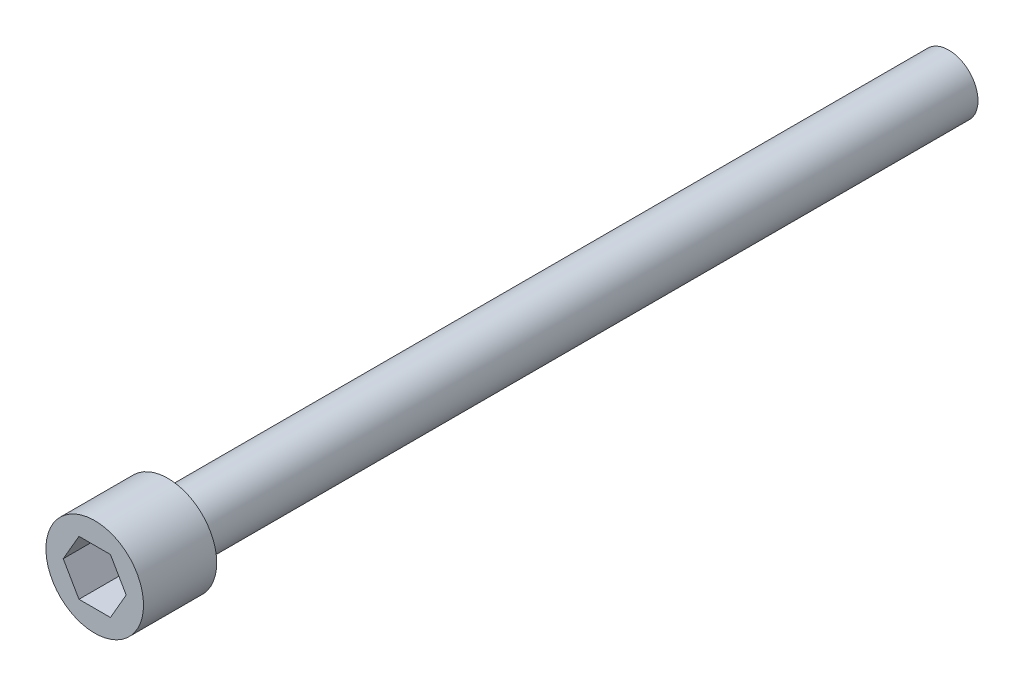
ISO-10303-21;
HEADER;
FILE_DESCRIPTION(('STEP AP214'),'2;1');
FILE_NAME('part.step','',(''),(''),'','','');
FILE_SCHEMA(('AUTOMOTIVE_DESIGN { 1 0 10303 214 1 1 1 1 }'));
ENDSEC;
DATA;
#1=APPLICATION_CONTEXT('core data for automotive mechanical design processes');
#2=APPLICATION_PROTOCOL_DEFINITION('international standard','automotive_design',2000,#1);
#3=PRODUCT_CONTEXT('',#1,'mechanical');
#4=PRODUCT('Part','Part','',(#3));
#5=PRODUCT_RELATED_PRODUCT_CATEGORY('part','',(#4));
#6=PRODUCT_DEFINITION_FORMATION('','',#4);
#7=PRODUCT_DEFINITION_CONTEXT('part definition',#1,'design');
#8=PRODUCT_DEFINITION('design','',#6,#7);
#9=PRODUCT_DEFINITION_SHAPE('','',#8);
#10=(LENGTH_UNIT() NAMED_UNIT(*) SI_UNIT(.MILLI.,.METRE.));
#11=(NAMED_UNIT(*) PLANE_ANGLE_UNIT() SI_UNIT($,.RADIAN.));
#12=(NAMED_UNIT(*) SI_UNIT($,.STERADIAN.) SOLID_ANGLE_UNIT());
#13=UNCERTAINTY_MEASURE_WITH_UNIT(LENGTH_MEASURE(1.E-05),#10,'distance_accuracy_value','');
#14=(GEOMETRIC_REPRESENTATION_CONTEXT(3) GLOBAL_UNCERTAINTY_ASSIGNED_CONTEXT((#13)) GLOBAL_UNIT_ASSIGNED_CONTEXT((#10,
#11,#12)) REPRESENTATION_CONTEXT('',''));
#15=CARTESIAN_POINT('',(0.,0.,0.));
#16=DIRECTION('',(0.,0.,1.));
#17=DIRECTION('',(1.,0.,0.));
#18=AXIS2_PLACEMENT_3D('',#15,#16,#17);
#19=CARTESIAN_POINT('',(-15.,15.,-32.));
#20=DIRECTION('',(0.,0.,1.));
#21=DIRECTION('',(1.,0.,0.));
#22=AXIS2_PLACEMENT_3D('',#19,#20,#21);
#23=CYLINDRICAL_SURFACE('',#22,1.2);
#24=CARTESIAN_POINT('',(-15.,15.,-32.));
#25=DIRECTION('',(0.,0.,1.));
#26=DIRECTION('',(1.,0.,0.));
#27=AXIS2_PLACEMENT_3D('',#24,#25,#26);
#28=CIRCLE('',#27,1.2);
#29=CARTESIAN_POINT('',(-13.8,15.,-32.));
#30=VERTEX_POINT('',#29);
#31=EDGE_CURVE('E11',#30,#30,#28,.T.);
#32=ORIENTED_EDGE('',*,*,#31,.T.);
#33=EDGE_LOOP('',(#32));
#34=FACE_BOUND('',#33,.T.);
#35=CARTESIAN_POINT('',(-15.,15.,0.));
#36=DIRECTION('',(0.,0.,1.));
#37=DIRECTION('',(1.,0.,0.));
#38=AXIS2_PLACEMENT_3D('',#35,#36,#37);
#39=CIRCLE('',#38,1.2);
#40=CARTESIAN_POINT('',(-13.8,15.,0.));
#41=VERTEX_POINT('',#40);
#42=EDGE_CURVE('E36',#41,#41,#39,.T.);
#43=ORIENTED_EDGE('',*,*,#42,.F.);
#44=EDGE_LOOP('',(#43));
#45=FACE_BOUND('',#44,.T.);
#46=ADVANCED_FACE('F33',(#34,#45),#23,.T.);
#47=CARTESIAN_POINT('',(-15.,15.,-32.));
#48=DIRECTION('',(0.,0.,1.));
#49=DIRECTION('',(1.,0.,0.));
#50=AXIS2_PLACEMENT_3D('',#47,#48,#49);
#51=PLANE('',#50);
#52=ORIENTED_EDGE('',*,*,#31,.F.);
#53=EDGE_LOOP('',(#52));
#54=FACE_BOUND('',#53,.T.);
#55=ADVANCED_FACE('F165',(#54),#51,.F.);
#56=CARTESIAN_POINT('',(-15.,15.,3.));
#57=DIRECTION('',(0.,0.,-1.));
#58=DIRECTION('',(-1.,0.,0.));
#59=AXIS2_PLACEMENT_3D('',#56,#57,#58);
#60=CYLINDRICAL_SURFACE('',#59,2.);
#61=CARTESIAN_POINT('',(-15.,15.,3.));
#62=DIRECTION('',(0.,0.,1.));
#63=DIRECTION('',(1.,0.,0.));
#64=AXIS2_PLACEMENT_3D('',#61,#62,#63);
#65=CIRCLE('',#64,2.);
#66=CARTESIAN_POINT('',(-13.,15.,3.));
#67=VERTEX_POINT('',#66);
#68=EDGE_CURVE('E140',#67,#67,#65,.T.);
#69=ORIENTED_EDGE('',*,*,#68,.F.);
#70=EDGE_LOOP('',(#69));
#71=FACE_BOUND('',#70,.T.);
#72=CARTESIAN_POINT('',(-15.,15.,0.));
#73=DIRECTION('',(0.,0.,1.));
#74=DIRECTION('',(1.,0.,0.));
#75=AXIS2_PLACEMENT_3D('',#72,#73,#74);
#76=CIRCLE('',#75,2.);
#77=CARTESIAN_POINT('',(-13.,15.,0.));
#78=VERTEX_POINT('',#77);
#79=EDGE_CURVE('E134',#78,#78,#76,.T.);
#80=ORIENTED_EDGE('',*,*,#79,.T.);
#81=EDGE_LOOP('',(#80));
#82=FACE_BOUND('',#81,.T.);
#83=ADVANCED_FACE('F146',(#71,#82),#60,.T.);
#84=CARTESIAN_POINT('',(-15.,15.,3.));
#85=DIRECTION('',(0.,0.,1.));
#86=DIRECTION('',(1.,0.,0.));
#87=AXIS2_PLACEMENT_3D('',#84,#85,#86);
#88=PLANE('',#87);
#89=DIRECTION('',(0.499999999999995,0.866025403784442,0.));
#90=VECTOR('',#89,1.);
#91=CARTESIAN_POINT('',(-14.3549738433214,13.8827819244218,3.));
#92=LINE('',#91,#90);
#93=CARTESIAN_POINT('',(-14.3549738433214,13.8827819244218,3.));
#94=VERTEX_POINT('',#93);
#95=CARTESIAN_POINT('',(-13.7099476866428,15.,3.));
#96=VERTEX_POINT('',#95);
#97=EDGE_CURVE('E47',#94,#96,#92,.T.);
#98=ORIENTED_EDGE('',*,*,#97,.F.);
#99=DIRECTION('',(1.,0.,0.));
#100=VECTOR('',#99,1.);
#101=CARTESIAN_POINT('',(-15.6450261566786,13.8827819244218,3.));
#102=LINE('',#101,#100);
#103=CARTESIAN_POINT('',(-15.6450261566786,13.8827819244218,3.));
#104=VERTEX_POINT('',#103);
#105=EDGE_CURVE('E130',#104,#94,#102,.T.);
#106=ORIENTED_EDGE('',*,*,#105,.F.);
#107=DIRECTION('',(0.500000000000006,-0.866025403784435,0.));
#108=VECTOR('',#107,1.);
#109=CARTESIAN_POINT('',(-16.2900523133572,15.,3.));
#110=LINE('',#109,#108);
#111=CARTESIAN_POINT('',(-16.2900523133572,15.,3.));
#112=VERTEX_POINT('',#111);
#113=EDGE_CURVE('E128',#112,#104,#110,.T.);
#114=ORIENTED_EDGE('',*,*,#113,.F.);
#115=DIRECTION('',(-0.499999999999995,-0.866025403784442,0.));
#116=VECTOR('',#115,1.);
#117=CARTESIAN_POINT('',(-15.6450261566786,16.1172180755782,3.));
#118=LINE('',#117,#116);
#119=CARTESIAN_POINT('',(-15.6450261566786,16.1172180755782,3.));
#120=VERTEX_POINT('',#119);
#121=EDGE_CURVE('E95',#120,#112,#118,.T.);
#122=ORIENTED_EDGE('',*,*,#121,.F.);
#123=DIRECTION('',(-1.,0.,0.));
#124=VECTOR('',#123,1.);
#125=CARTESIAN_POINT('',(-14.3549738433214,16.1172180755782,3.));
#126=LINE('',#125,#124);
#127=CARTESIAN_POINT('',(-14.3549738433214,16.1172180755782,3.));
#128=VERTEX_POINT('',#127);
#129=EDGE_CURVE('E124',#128,#120,#126,.T.);
#130=ORIENTED_EDGE('',*,*,#129,.F.);
#131=DIRECTION('',(-0.500000000000002,0.866025403784438,0.));
#132=VECTOR('',#131,1.);
#133=CARTESIAN_POINT('',(-13.7099476866428,15.,3.));
#134=LINE('',#133,#132);
#135=EDGE_CURVE('E121',#96,#128,#134,.T.);
#136=ORIENTED_EDGE('',*,*,#135,.F.);
#137=EDGE_LOOP('',(#98,#106,#114,#122,#130,#136));
#138=FACE_BOUND('',#137,.T.);
#139=ORIENTED_EDGE('',*,*,#68,.T.);
#140=EDGE_LOOP('',(#139));
#141=FACE_BOUND('',#140,.T.);
#142=ADVANCED_FACE('F151',(#138,#141),#88,.T.);
#143=CARTESIAN_POINT('',(-15.,15.,0.));
#144=DIRECTION('',(0.,0.,1.));
#145=DIRECTION('',(1.,0.,0.));
#146=AXIS2_PLACEMENT_3D('',#143,#144,#145);
#147=PLANE('',#146);
#148=ORIENTED_EDGE('',*,*,#42,.T.);
#149=EDGE_LOOP('',(#148));
#150=FACE_BOUND('',#149,.T.);
#151=ORIENTED_EDGE('',*,*,#79,.F.);
#152=EDGE_LOOP('',(#151));
#153=FACE_BOUND('',#152,.T.);
#154=ADVANCED_FACE('F148',(#150,#153),#147,.F.);
#155=CARTESIAN_POINT('',(-14.3549738433214,13.8827819244218,1.));
#156=DIRECTION('',(0.866025403784442,-0.499999999999995,0.));
#157=DIRECTION('',(0.499999999999995,0.866025403784442,0.));
#158=AXIS2_PLACEMENT_3D('',#155,#156,#157);
#159=PLANE('',#158);
#160=ORIENTED_EDGE('',*,*,#97,.T.);
#161=DIRECTION('',(0.,0.,1.));
#162=VECTOR('',#161,1.);
#163=CARTESIAN_POINT('',(-13.7099476866428,15.,1.));
#164=LINE('',#163,#162);
#165=CARTESIAN_POINT('',(-13.7099476866428,15.,1.));
#166=VERTEX_POINT('',#165);
#167=EDGE_CURVE('E77',#166,#96,#164,.T.);
#168=ORIENTED_EDGE('',*,*,#167,.F.);
#169=DIRECTION('',(0.499999999999995,0.866025403784442,0.));
#170=VECTOR('',#169,1.);
#171=CARTESIAN_POINT('',(-14.3549738433214,13.8827819244218,1.));
#172=LINE('',#171,#170);
#173=CARTESIAN_POINT('',(-14.3549738433214,13.8827819244218,1.));
#174=VERTEX_POINT('',#173);
#175=EDGE_CURVE('E132',#174,#166,#172,.T.);
#176=ORIENTED_EDGE('',*,*,#175,.F.);
#177=DIRECTION('',(0.,0.,1.));
#178=VECTOR('',#177,1.);
#179=CARTESIAN_POINT('',(-14.3549738433214,13.8827819244218,1.));
#180=LINE('',#179,#178);
#181=EDGE_CURVE('E55',#174,#94,#180,.T.);
#182=ORIENTED_EDGE('',*,*,#181,.T.);
#183=EDGE_LOOP('',(#160,#168,#176,#182));
#184=FACE_BOUND('',#183,.T.);
#185=ADVANCED_FACE('F150',(#184),#159,.F.);
#186=CARTESIAN_POINT('',(-15.6450261566786,13.8827819244218,1.));
#187=DIRECTION('',(0.,-1.,0.));
#188=DIRECTION('',(1.,0.,0.));
#189=AXIS2_PLACEMENT_3D('',#186,#187,#188);
#190=PLANE('',#189);
#191=ORIENTED_EDGE('',*,*,#105,.T.);
#192=ORIENTED_EDGE('',*,*,#181,.F.);
#193=DIRECTION('',(1.,0.,0.));
#194=VECTOR('',#193,1.);
#195=CARTESIAN_POINT('',(-15.6450261566786,13.8827819244218,1.));
#196=LINE('',#195,#194);
#197=CARTESIAN_POINT('',(-15.6450261566786,13.8827819244218,1.));
#198=VERTEX_POINT('',#197);
#199=EDGE_CURVE('E107',#198,#174,#196,.T.);
#200=ORIENTED_EDGE('',*,*,#199,.F.);
#201=DIRECTION('',(0.,0.,1.));
#202=VECTOR('',#201,1.);
#203=CARTESIAN_POINT('',(-15.6450261566786,13.8827819244218,1.));
#204=LINE('',#203,#202);
#205=EDGE_CURVE('E99',#198,#104,#204,.T.);
#206=ORIENTED_EDGE('',*,*,#205,.T.);
#207=EDGE_LOOP('',(#191,#192,#200,#206));
#208=FACE_BOUND('',#207,.T.);
#209=ADVANCED_FACE('F158',(#208),#190,.F.);
#210=CARTESIAN_POINT('',(-16.2900523133572,15.,1.));
#211=DIRECTION('',(-0.866025403784435,-0.500000000000006,0.));
#212=DIRECTION('',(0.500000000000006,-0.866025403784435,0.));
#213=AXIS2_PLACEMENT_3D('',#210,#211,#212);
#214=PLANE('',#213);
#215=ORIENTED_EDGE('',*,*,#113,.T.);
#216=ORIENTED_EDGE('',*,*,#205,.F.);
#217=DIRECTION('',(0.500000000000006,-0.866025403784435,0.));
#218=VECTOR('',#217,1.);
#219=CARTESIAN_POINT('',(-16.2900523133572,15.,1.));
#220=LINE('',#219,#218);
#221=CARTESIAN_POINT('',(-16.2900523133572,15.,1.));
#222=VERTEX_POINT('',#221);
#223=EDGE_CURVE('E103',#222,#198,#220,.T.);
#224=ORIENTED_EDGE('',*,*,#223,.F.);
#225=DIRECTION('',(0.,0.,1.));
#226=VECTOR('',#225,1.);
#227=CARTESIAN_POINT('',(-16.2900523133572,15.,1.));
#228=LINE('',#227,#226);
#229=EDGE_CURVE('E88',#222,#112,#228,.T.);
#230=ORIENTED_EDGE('',*,*,#229,.T.);
#231=EDGE_LOOP('',(#215,#216,#224,#230));
#232=FACE_BOUND('',#231,.T.);
#233=ADVANCED_FACE('F104',(#232),#214,.F.);
#234=CARTESIAN_POINT('',(-15.6450261566786,16.1172180755782,1.));
#235=DIRECTION('',(-0.866025403784442,0.499999999999995,0.));
#236=DIRECTION('',(-0.499999999999995,-0.866025403784442,0.));
#237=AXIS2_PLACEMENT_3D('',#234,#235,#236);
#238=PLANE('',#237);
#239=ORIENTED_EDGE('',*,*,#121,.T.);
#240=ORIENTED_EDGE('',*,*,#229,.F.);
#241=DIRECTION('',(-0.499999999999995,-0.866025403784442,0.));
#242=VECTOR('',#241,1.);
#243=CARTESIAN_POINT('',(-15.6450261566786,16.1172180755782,1.));
#244=LINE('',#243,#242);
#245=CARTESIAN_POINT('',(-15.6450261566786,16.1172180755782,1.));
#246=VERTEX_POINT('',#245);
#247=EDGE_CURVE('E92',#246,#222,#244,.T.);
#248=ORIENTED_EDGE('',*,*,#247,.F.);
#249=DIRECTION('',(0.,0.,1.));
#250=VECTOR('',#249,1.);
#251=CARTESIAN_POINT('',(-15.6450261566786,16.1172180755782,1.));
#252=LINE('',#251,#250);
#253=EDGE_CURVE('E100',#246,#120,#252,.T.);
#254=ORIENTED_EDGE('',*,*,#253,.T.);
#255=EDGE_LOOP('',(#239,#240,#248,#254));
#256=FACE_BOUND('',#255,.T.);
#257=ADVANCED_FACE('F90',(#256),#238,.F.);
#258=CARTESIAN_POINT('',(-14.3549738433214,16.1172180755782,1.));
#259=DIRECTION('',(0.,1.,0.));
#260=DIRECTION('',(-1.,0.,0.));
#261=AXIS2_PLACEMENT_3D('',#258,#259,#260);
#262=PLANE('',#261);
#263=ORIENTED_EDGE('',*,*,#129,.T.);
#264=ORIENTED_EDGE('',*,*,#253,.F.);
#265=DIRECTION('',(-1.,0.,0.));
#266=VECTOR('',#265,1.);
#267=CARTESIAN_POINT('',(-14.3549738433214,16.1172180755782,1.));
#268=LINE('',#267,#266);
#269=CARTESIAN_POINT('',(-14.3549738433214,16.1172180755782,1.));
#270=VERTEX_POINT('',#269);
#271=EDGE_CURVE('E113',#270,#246,#268,.T.);
#272=ORIENTED_EDGE('',*,*,#271,.F.);
#273=DIRECTION('',(0.,0.,1.));
#274=VECTOR('',#273,1.);
#275=CARTESIAN_POINT('',(-14.3549738433214,16.1172180755782,1.));
#276=LINE('',#275,#274);
#277=EDGE_CURVE('E137',#270,#128,#276,.T.);
#278=ORIENTED_EDGE('',*,*,#277,.T.);
#279=EDGE_LOOP('',(#263,#264,#272,#278));
#280=FACE_BOUND('',#279,.T.);
#281=ADVANCED_FACE('F219',(#280),#262,.F.);
#282=CARTESIAN_POINT('',(-13.7099476866428,15.,1.));
#283=DIRECTION('',(0.866025403784438,0.500000000000002,0.));
#284=DIRECTION('',(-0.500000000000002,0.866025403784438,0.));
#285=AXIS2_PLACEMENT_3D('',#282,#283,#284);
#286=PLANE('',#285);
#287=ORIENTED_EDGE('',*,*,#135,.T.);
#288=ORIENTED_EDGE('',*,*,#277,.F.);
#289=DIRECTION('',(-0.500000000000002,0.866025403784438,0.));
#290=VECTOR('',#289,1.);
#291=CARTESIAN_POINT('',(-13.7099476866428,15.,1.));
#292=LINE('',#291,#290);
#293=EDGE_CURVE('E115',#166,#270,#292,.T.);
#294=ORIENTED_EDGE('',*,*,#293,.F.);
#295=ORIENTED_EDGE('',*,*,#167,.T.);
#296=EDGE_LOOP('',(#287,#288,#294,#295));
#297=FACE_BOUND('',#296,.T.);
#298=ADVANCED_FACE('F228',(#297),#286,.F.);
#299=CARTESIAN_POINT('',(0.,0.,1.));
#300=DIRECTION('',(0.,0.,1.));
#301=DIRECTION('',(1.,0.,0.));
#302=AXIS2_PLACEMENT_3D('',#299,#300,#301);
#303=PLANE('',#302);
#304=ORIENTED_EDGE('',*,*,#175,.T.);
#305=ORIENTED_EDGE('',*,*,#293,.T.);
#306=ORIENTED_EDGE('',*,*,#271,.T.);
#307=ORIENTED_EDGE('',*,*,#247,.T.);
#308=ORIENTED_EDGE('',*,*,#223,.T.);
#309=ORIENTED_EDGE('',*,*,#199,.T.);
#310=EDGE_LOOP('',(#304,#305,#306,#307,#308,#309));
#311=FACE_BOUND('',#310,.T.);
#312=ADVANCED_FACE('F110',(#311),#303,.T.);
#313=CLOSED_SHELL('',(#46,#55,#83,#142,#154,#185,#209,#233,#257,#281,#298,#312));
#314=MANIFOLD_SOLID_BREP('B2',#313);
#315=ADVANCED_BREP_SHAPE_REPRESENTATION('',(#18,#314),#14);
#316=SHAPE_DEFINITION_REPRESENTATION(#9,#315);
ENDSEC;
END-ISO-10303-21;
